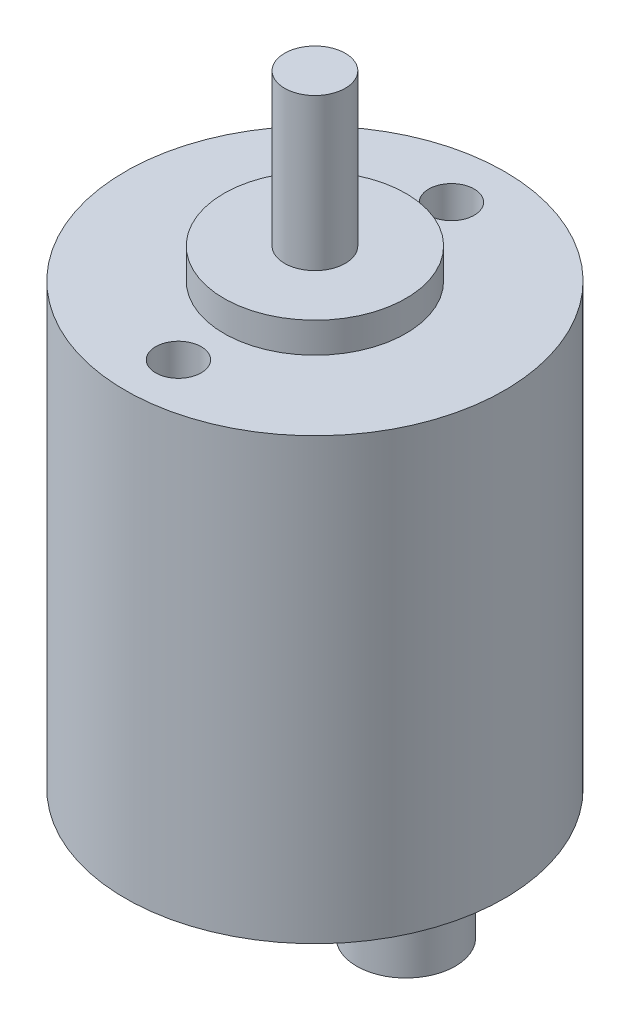
ISO-10303-21;
HEADER;
FILE_DESCRIPTION(('STEP AP214'),'2;1');
FILE_NAME('part.step','',(''),(''),'','','');
FILE_SCHEMA(('AUTOMOTIVE_DESIGN { 1 0 10303 214 1 1 1 1 }'));
ENDSEC;
DATA;
#1=APPLICATION_CONTEXT('core data for automotive mechanical design processes');
#2=APPLICATION_PROTOCOL_DEFINITION('international standard','automotive_design',2000,#1);
#3=PRODUCT_CONTEXT('',#1,'mechanical');
#4=PRODUCT('Part','Part','',(#3));
#5=PRODUCT_RELATED_PRODUCT_CATEGORY('part','',(#4));
#6=PRODUCT_DEFINITION_FORMATION('','',#4);
#7=PRODUCT_DEFINITION_CONTEXT('part definition',#1,'design');
#8=PRODUCT_DEFINITION('design','',#6,#7);
#9=PRODUCT_DEFINITION_SHAPE('','',#8);
#10=(LENGTH_UNIT() NAMED_UNIT(*) SI_UNIT(.MILLI.,.METRE.));
#11=(NAMED_UNIT(*) PLANE_ANGLE_UNIT() SI_UNIT($,.RADIAN.));
#12=(NAMED_UNIT(*) SI_UNIT($,.STERADIAN.) SOLID_ANGLE_UNIT());
#13=UNCERTAINTY_MEASURE_WITH_UNIT(LENGTH_MEASURE(1.E-05),#10,'distance_accuracy_value','');
#14=(GEOMETRIC_REPRESENTATION_CONTEXT(3) GLOBAL_UNCERTAINTY_ASSIGNED_CONTEXT((#13)) GLOBAL_UNIT_ASSIGNED_CONTEXT((#10,
#11,#12)) REPRESENTATION_CONTEXT('',''));
#15=CARTESIAN_POINT('',(0.,0.,0.));
#16=DIRECTION('',(0.,0.,1.));
#17=DIRECTION('',(1.,0.,0.));
#18=AXIS2_PLACEMENT_3D('',#15,#16,#17);
#19=CARTESIAN_POINT('',(0.,29.,0.));
#20=DIRECTION('',(0.,-1.,0.));
#21=DIRECTION('',(0.,0.,-1.));
#22=AXIS2_PLACEMENT_3D('',#19,#20,#21);
#23=CYLINDRICAL_SURFACE('',#22,12.5);
#24=CARTESIAN_POINT('',(0.,29.,0.));
#25=DIRECTION('',(0.,1.,0.));
#26=DIRECTION('',(0.,0.,1.));
#27=AXIS2_PLACEMENT_3D('',#24,#25,#26);
#28=CIRCLE('',#27,12.5);
#29=CARTESIAN_POINT('',(0.,29.,-12.5));
#30=VERTEX_POINT('',#29);
#31=EDGE_CURVE('E46',#30,#30,#28,.T.);
#32=CARTESIAN_POINT('',(0.,0.,0.));
#33=DIRECTION('',(0.,1.,0.));
#34=DIRECTION('',(0.,0.,1.));
#35=AXIS2_PLACEMENT_3D('',#32,#33,#34);
#36=CIRCLE('',#35,12.5);
#37=CARTESIAN_POINT('',(0.,0.,-12.5));
#38=VERTEX_POINT('',#37);
#39=EDGE_CURVE('E54',#38,#38,#36,.T.);
#40=CARTESIAN_POINT('',(0.,29.,-12.5));
#41=CARTESIAN_POINT('',(0.,28.6979166666667,-12.5));
#42=CARTESIAN_POINT('',(0.,28.3958333333333,-12.5));
#43=CARTESIAN_POINT('',(0.,27.7916666666667,-12.5));
#44=CARTESIAN_POINT('',(0.,27.4895833333333,-12.5));
#45=CARTESIAN_POINT('',(0.,26.8854166666667,-12.5));
#46=CARTESIAN_POINT('',(0.,26.5833333333333,-12.5));
#47=CARTESIAN_POINT('',(0.,25.9791666666667,-12.5));
#48=CARTESIAN_POINT('',(0.,25.6770833333333,-12.5));
#49=CARTESIAN_POINT('',(0.,25.0729166666667,-12.5));
#50=CARTESIAN_POINT('',(0.,24.7708333333333,-12.5));
#51=CARTESIAN_POINT('',(0.,24.1666666666667,-12.5));
#52=CARTESIAN_POINT('',(0.,23.8645833333333,-12.5));
#53=CARTESIAN_POINT('',(0.,23.2604166666667,-12.5));
#54=CARTESIAN_POINT('',(0.,22.9583333333333,-12.5));
#55=CARTESIAN_POINT('',(0.,22.3541666666667,-12.5));
#56=CARTESIAN_POINT('',(0.,22.0520833333333,-12.5));
#57=CARTESIAN_POINT('',(0.,21.4479166666667,-12.5));
#58=CARTESIAN_POINT('',(0.,21.1458333333333,-12.5));
#59=CARTESIAN_POINT('',(0.,20.5416666666667,-12.5));
#60=CARTESIAN_POINT('',(0.,20.2395833333333,-12.5));
#61=CARTESIAN_POINT('',(0.,19.6354166666667,-12.5));
#62=CARTESIAN_POINT('',(0.,19.3333333333333,-12.5));
#63=CARTESIAN_POINT('',(0.,18.7291666666667,-12.5));
#64=CARTESIAN_POINT('',(0.,18.4270833333333,-12.5));
#65=CARTESIAN_POINT('',(0.,17.8229166666667,-12.5));
#66=CARTESIAN_POINT('',(0.,17.5208333333333,-12.5));
#67=CARTESIAN_POINT('',(0.,16.9166666666667,-12.5));
#68=CARTESIAN_POINT('',(0.,16.6145833333333,-12.5));
#69=CARTESIAN_POINT('',(0.,16.0104166666667,-12.5));
#70=CARTESIAN_POINT('',(0.,15.7083333333333,-12.5));
#71=CARTESIAN_POINT('',(0.,15.1041666666667,-12.5));
#72=CARTESIAN_POINT('',(0.,14.8020833333333,-12.5));
#73=CARTESIAN_POINT('',(0.,14.1979166666667,-12.5));
#74=CARTESIAN_POINT('',(0.,13.8958333333333,-12.5));
#75=CARTESIAN_POINT('',(0.,13.2916666666667,-12.5));
#76=CARTESIAN_POINT('',(0.,12.9895833333333,-12.5));
#77=CARTESIAN_POINT('',(0.,12.3854166666667,-12.5));
#78=CARTESIAN_POINT('',(0.,12.0833333333333,-12.5));
#79=CARTESIAN_POINT('',(0.,11.4791666666667,-12.5));
#80=CARTESIAN_POINT('',(0.,11.1770833333333,-12.5));
#81=CARTESIAN_POINT('',(0.,10.5729166666667,-12.5));
#82=CARTESIAN_POINT('',(0.,10.2708333333333,-12.5));
#83=CARTESIAN_POINT('',(0.,9.66666666666667,-12.5));
#84=CARTESIAN_POINT('',(0.,9.36458333333333,-12.5));
#85=CARTESIAN_POINT('',(0.,8.76041666666667,-12.5));
#86=CARTESIAN_POINT('',(0.,8.45833333333333,-12.5));
#87=CARTESIAN_POINT('',(0.,7.85416666666667,-12.5));
#88=CARTESIAN_POINT('',(0.,7.55208333333333,-12.5));
#89=CARTESIAN_POINT('',(0.,6.94791666666667,-12.5));
#90=CARTESIAN_POINT('',(0.,6.64583333333333,-12.5));
#91=CARTESIAN_POINT('',(0.,6.04166666666667,-12.5));
#92=CARTESIAN_POINT('',(0.,5.73958333333333,-12.5));
#93=CARTESIAN_POINT('',(0.,5.13541666666667,-12.5));
#94=CARTESIAN_POINT('',(0.,4.83333333333333,-12.5));
#95=CARTESIAN_POINT('',(0.,4.22916666666667,-12.5));
#96=CARTESIAN_POINT('',(0.,3.92708333333333,-12.5));
#97=CARTESIAN_POINT('',(0.,3.32291666666667,-12.5));
#98=CARTESIAN_POINT('',(0.,3.02083333333333,-12.5));
#99=CARTESIAN_POINT('',(0.,2.41666666666667,-12.5));
#100=CARTESIAN_POINT('',(0.,2.11458333333333,-12.5));
#101=CARTESIAN_POINT('',(0.,1.51041666666667,-12.5));
#102=CARTESIAN_POINT('',(0.,1.20833333333333,-12.5));
#103=CARTESIAN_POINT('',(0.,0.604166666666667,-12.5));
#104=CARTESIAN_POINT('',(0.,0.302083333333333,-12.5));
#105=CARTESIAN_POINT('',(0.,0.,-12.5));
#106=B_SPLINE_CURVE_WITH_KNOTS('',3,(#40,#41,#42,#43,#44,#45,#46,#47,#48,#49,#50,#51,#52,#53,
#54,#55,#56,#57,#58,#59,#60,#61,#62,#63,#64,#65,#66,#67,#68,#69,#70,#71,#72,#73,#74,#75,#76,#77,
#78,#79,#80,#81,#82,#83,#84,#85,#86,#87,#88,#89,#90,#91,#92,#93,#94,#95,#96,#97,#98,#99,#100,
#101,#102,#103,#104,#105),.UNSPECIFIED.,.F.,.F.,(4,2,2,2,2,2,2,2,2,2,2,2,2,2,2,2,2,2,2,2,2,2,2,
2,2,2,2,2,2,2,2,2,4),(0.,0.906250000000001,1.8125,2.71875,3.625,4.53125,5.4375,6.34375,7.25,
8.15625,9.0625,9.96875,10.875,11.78125,12.6875,13.59375,14.5,15.40625,16.3125,17.21875,18.125,
19.03125,19.9375,20.84375,21.75,22.65625,23.5625,24.46875,25.375,26.28125,27.1875,28.09375,29.),.UNSPECIFIED.);
#107=EDGE_CURVE('BSEAM31',#30,#38,#106,.T.);
#108=ORIENTED_EDGE('',*,*,#31,.F.);
#109=ORIENTED_EDGE('',*,*,#39,.T.);
#110=ORIENTED_EDGE('',*,*,#107,.T.);
#111=ORIENTED_EDGE('',*,*,#107,.F.);
#112=EDGE_LOOP('',(#108,#110,#109,#111));
#113=FACE_BOUND('',#112,.T.);
#114=ADVANCED_FACE('F31',(#113),#23,.T.);
#115=CARTESIAN_POINT('',(0.,29.,0.));
#116=DIRECTION('',(0.,1.,0.));
#117=DIRECTION('',(0.,0.,1.));
#118=AXIS2_PLACEMENT_3D('',#115,#116,#117);
#119=PLANE('',#118);
#120=CARTESIAN_POINT('',(0.,29.,9.));
#121=DIRECTION('',(0.,1.,0.));
#122=DIRECTION('',(0.,0.,1.));
#123=AXIS2_PLACEMENT_3D('',#120,#121,#122);
#124=CIRCLE('',#123,1.5);
#125=CARTESIAN_POINT('',(0.,29.,10.5));
#126=VERTEX_POINT('',#125);
#127=EDGE_CURVE('E62',#126,#126,#124,.T.);
#128=ORIENTED_EDGE('',*,*,#127,.F.);
#129=EDGE_LOOP('',(#128));
#130=FACE_BOUND('',#129,.T.);
#131=CARTESIAN_POINT('',(0.,29.,-9.));
#132=DIRECTION('',(0.,1.,0.));
#133=DIRECTION('',(0.,0.,1.));
#134=AXIS2_PLACEMENT_3D('',#131,#132,#133);
#135=CIRCLE('',#134,1.5);
#136=CARTESIAN_POINT('',(0.,29.,-7.5));
#137=VERTEX_POINT('',#136);
#138=EDGE_CURVE('E60',#137,#137,#135,.T.);
#139=ORIENTED_EDGE('',*,*,#138,.F.);
#140=EDGE_LOOP('',(#139));
#141=FACE_BOUND('',#140,.T.);
#142=CARTESIAN_POINT('',(0.,29.,0.));
#143=DIRECTION('',(0.,1.,0.));
#144=DIRECTION('',(-1.,0.,0.));
#145=AXIS2_PLACEMENT_3D('',#142,#143,#144);
#146=CIRCLE('',#145,6.);
#147=CARTESIAN_POINT('',(-6.,29.,0.));
#148=VERTEX_POINT('',#147);
#149=EDGE_CURVE('E41',#148,#148,#146,.T.);
#150=ORIENTED_EDGE('',*,*,#149,.F.);
#151=EDGE_LOOP('',(#150));
#152=FACE_BOUND('',#151,.T.);
#153=ORIENTED_EDGE('',*,*,#31,.T.);
#154=EDGE_LOOP('',(#153));
#155=FACE_BOUND('',#154,.T.);
#156=ADVANCED_FACE('F86',(#130,#141,#152,#155),#119,.T.);
#157=CARTESIAN_POINT('',(0.,0.,0.));
#158=DIRECTION('',(0.,1.,0.));
#159=DIRECTION('',(0.,0.,1.));
#160=AXIS2_PLACEMENT_3D('',#157,#158,#159);
#161=PLANE('',#160);
#162=CARTESIAN_POINT('',(6.,0.,0.));
#163=DIRECTION('',(0.,1.,0.));
#164=DIRECTION('',(0.,0.,1.));
#165=AXIS2_PLACEMENT_3D('',#162,#163,#164);
#166=CIRCLE('',#165,3.25);
#167=CARTESIAN_POINT('',(6.,0.,3.25));
#168=VERTEX_POINT('',#167);
#169=EDGE_CURVE('E10',#168,#168,#166,.F.);
#170=ORIENTED_EDGE('',*,*,#169,.F.);
#171=EDGE_LOOP('',(#170));
#172=FACE_BOUND('',#171,.T.);
#173=ORIENTED_EDGE('',*,*,#39,.F.);
#174=EDGE_LOOP('',(#173));
#175=FACE_BOUND('',#174,.T.);
#176=ADVANCED_FACE('F91',(#172,#175),#161,.F.);
#177=CARTESIAN_POINT('',(0.,31.,0.));
#178=DIRECTION('',(0.,-1.,0.));
#179=DIRECTION('',(1.,0.,0.));
#180=AXIS2_PLACEMENT_3D('',#177,#178,#179);
#181=CYLINDRICAL_SURFACE('',#180,6.);
#182=CARTESIAN_POINT('',(0.,31.,0.));
#183=DIRECTION('',(0.,1.,0.));
#184=DIRECTION('',(-1.,0.,0.));
#185=AXIS2_PLACEMENT_3D('',#182,#183,#184);
#186=CIRCLE('',#185,6.);
#187=CARTESIAN_POINT('',(-6.,31.,0.));
#188=VERTEX_POINT('',#187);
#189=EDGE_CURVE('E52',#188,#188,#186,.T.);
#190=ORIENTED_EDGE('',*,*,#189,.F.);
#191=EDGE_LOOP('',(#190));
#192=FACE_BOUND('',#191,.T.);
#193=ORIENTED_EDGE('',*,*,#149,.T.);
#194=EDGE_LOOP('',(#193));
#195=FACE_BOUND('',#194,.T.);
#196=ADVANCED_FACE('F82',(#192,#195),#181,.T.);
#197=CARTESIAN_POINT('',(0.,31.,0.));
#198=DIRECTION('',(0.,1.,0.));
#199=DIRECTION('',(-1.,0.,0.));
#200=AXIS2_PLACEMENT_3D('',#197,#198,#199);
#201=PLANE('',#200);
#202=CARTESIAN_POINT('',(0.,31.,0.));
#203=DIRECTION('',(0.,1.,0.));
#204=DIRECTION('',(-1.,0.,0.));
#205=AXIS2_PLACEMENT_3D('',#202,#203,#204);
#206=CIRCLE('',#205,2.);
#207=CARTESIAN_POINT('',(-2.,31.,0.));
#208=VERTEX_POINT('',#207);
#209=EDGE_CURVE('E37',#208,#208,#206,.T.);
#210=ORIENTED_EDGE('',*,*,#209,.F.);
#211=EDGE_LOOP('',(#210));
#212=FACE_BOUND('',#211,.T.);
#213=ORIENTED_EDGE('',*,*,#189,.T.);
#214=EDGE_LOOP('',(#213));
#215=FACE_BOUND('',#214,.T.);
#216=ADVANCED_FACE('F74',(#212,#215),#201,.T.);
#217=CARTESIAN_POINT('',(0.,41.,0.));
#218=DIRECTION('',(0.,-1.,0.));
#219=DIRECTION('',(1.,0.,0.));
#220=AXIS2_PLACEMENT_3D('',#217,#218,#219);
#221=CYLINDRICAL_SURFACE('',#220,2.);
#222=CARTESIAN_POINT('',(0.,41.,0.));
#223=DIRECTION('',(0.,1.,0.));
#224=DIRECTION('',(-1.,0.,0.));
#225=AXIS2_PLACEMENT_3D('',#222,#223,#224);
#226=CIRCLE('',#225,2.);
#227=CARTESIAN_POINT('',(-2.,41.,0.));
#228=VERTEX_POINT('',#227);
#229=EDGE_CURVE('E50',#228,#228,#226,.T.);
#230=ORIENTED_EDGE('',*,*,#229,.F.);
#231=EDGE_LOOP('',(#230));
#232=FACE_BOUND('',#231,.T.);
#233=ORIENTED_EDGE('',*,*,#209,.T.);
#234=EDGE_LOOP('',(#233));
#235=FACE_BOUND('',#234,.T.);
#236=ADVANCED_FACE('F72',(#232,#235),#221,.T.);
#237=CARTESIAN_POINT('',(0.,41.,0.));
#238=DIRECTION('',(0.,1.,0.));
#239=DIRECTION('',(-1.,0.,0.));
#240=AXIS2_PLACEMENT_3D('',#237,#238,#239);
#241=PLANE('',#240);
#242=ORIENTED_EDGE('',*,*,#229,.T.);
#243=EDGE_LOOP('',(#242));
#244=FACE_BOUND('',#243,.T.);
#245=ADVANCED_FACE('F70',(#244),#241,.T.);
#246=CARTESIAN_POINT('',(0.,22.,-9.));
#247=DIRECTION('',(0.,1.,0.));
#248=DIRECTION('',(-1.,0.,0.));
#249=AXIS2_PLACEMENT_3D('',#246,#247,#248);
#250=CYLINDRICAL_SURFACE('',#249,1.5);
#251=ORIENTED_EDGE('',*,*,#138,.T.);
#252=EDGE_LOOP('',(#251));
#253=FACE_BOUND('',#252,.T.);
#254=CARTESIAN_POINT('',(0.,22.,-9.));
#255=DIRECTION('',(0.,1.,0.));
#256=DIRECTION('',(-1.,0.,0.));
#257=AXIS2_PLACEMENT_3D('',#254,#255,#256);
#258=CIRCLE('',#257,1.5);
#259=CARTESIAN_POINT('',(-1.5,22.,-9.));
#260=VERTEX_POINT('',#259);
#261=EDGE_CURVE('E203',#260,#260,#258,.T.);
#262=ORIENTED_EDGE('',*,*,#261,.F.);
#263=EDGE_LOOP('',(#262));
#264=FACE_BOUND('',#263,.T.);
#265=ADVANCED_FACE('F80',(#253,#264),#250,.F.);
#266=CARTESIAN_POINT('',(0.,22.,-9.));
#267=DIRECTION('',(0.,1.,0.));
#268=DIRECTION('',(-1.,0.,0.));
#269=AXIS2_PLACEMENT_3D('',#266,#267,#268);
#270=PLANE('',#269);
#271=ORIENTED_EDGE('',*,*,#261,.T.);
#272=EDGE_LOOP('',(#271));
#273=FACE_BOUND('',#272,.T.);
#274=ADVANCED_FACE('F144',(#273),#270,.T.);
#275=CARTESIAN_POINT('',(0.,22.,9.));
#276=DIRECTION('',(0.,1.,0.));
#277=DIRECTION('',(-1.,0.,0.));
#278=AXIS2_PLACEMENT_3D('',#275,#276,#277);
#279=CYLINDRICAL_SURFACE('',#278,1.5);
#280=ORIENTED_EDGE('',*,*,#127,.T.);
#281=EDGE_LOOP('',(#280));
#282=FACE_BOUND('',#281,.T.);
#283=CARTESIAN_POINT('',(0.,22.,9.));
#284=DIRECTION('',(0.,1.,0.));
#285=DIRECTION('',(-1.,0.,0.));
#286=AXIS2_PLACEMENT_3D('',#283,#284,#285);
#287=CIRCLE('',#286,1.5);
#288=CARTESIAN_POINT('',(-1.5,22.,9.));
#289=VERTEX_POINT('',#288);
#290=EDGE_CURVE('E63',#289,#289,#287,.T.);
#291=ORIENTED_EDGE('',*,*,#290,.F.);
#292=EDGE_LOOP('',(#291));
#293=FACE_BOUND('',#292,.T.);
#294=ADVANCED_FACE('F154',(#282,#293),#279,.F.);
#295=CARTESIAN_POINT('',(0.,22.,9.));
#296=DIRECTION('',(0.,1.,0.));
#297=DIRECTION('',(-1.,0.,0.));
#298=AXIS2_PLACEMENT_3D('',#295,#296,#297);
#299=PLANE('',#298);
#300=ORIENTED_EDGE('',*,*,#290,.T.);
#301=EDGE_LOOP('',(#300));
#302=FACE_BOUND('',#301,.T.);
#303=ADVANCED_FACE('F164',(#302),#299,.T.);
#304=CARTESIAN_POINT('',(6.,-5.5,0.));
#305=DIRECTION('',(0.,1.,0.));
#306=DIRECTION('',(-1.,0.,0.));
#307=AXIS2_PLACEMENT_3D('',#304,#305,#306);
#308=CYLINDRICAL_SURFACE('',#307,3.25);
#309=CARTESIAN_POINT('',(6.,-5.5,0.));
#310=DIRECTION('',(0.,-1.,0.));
#311=DIRECTION('',(1.,0.,0.));
#312=AXIS2_PLACEMENT_3D('',#309,#310,#311);
#313=CIRCLE('',#312,3.25);
#314=CARTESIAN_POINT('',(9.25,-5.5,0.));
#315=VERTEX_POINT('',#314);
#316=EDGE_CURVE('E202',#315,#315,#313,.T.);
#317=ORIENTED_EDGE('',*,*,#316,.F.);
#318=EDGE_LOOP('',(#317));
#319=FACE_BOUND('',#318,.T.);
#320=ORIENTED_EDGE('',*,*,#169,.T.);
#321=EDGE_LOOP('',(#320));
#322=FACE_BOUND('',#321,.T.);
#323=ADVANCED_FACE('F172',(#319,#322),#308,.T.);
#324=CARTESIAN_POINT('',(6.,-5.5,0.));
#325=DIRECTION('',(0.,-1.,0.));
#326=DIRECTION('',(1.,0.,0.));
#327=AXIS2_PLACEMENT_3D('',#324,#325,#326);
#328=PLANE('',#327);
#329=ORIENTED_EDGE('',*,*,#316,.T.);
#330=EDGE_LOOP('',(#329));
#331=FACE_BOUND('',#330,.T.);
#332=ADVANCED_FACE('F186',(#331),#328,.T.);
#333=CLOSED_SHELL('',(#114,#156,#176,#196,#216,#236,#245,#265,#274,#294,#303,#323,#332));
#334=MANIFOLD_SOLID_BREP('B2',#333);
#335=ADVANCED_BREP_SHAPE_REPRESENTATION('',(#18,#334),#14);
#336=SHAPE_DEFINITION_REPRESENTATION(#9,#335);
ENDSEC;
END-ISO-10303-21;
